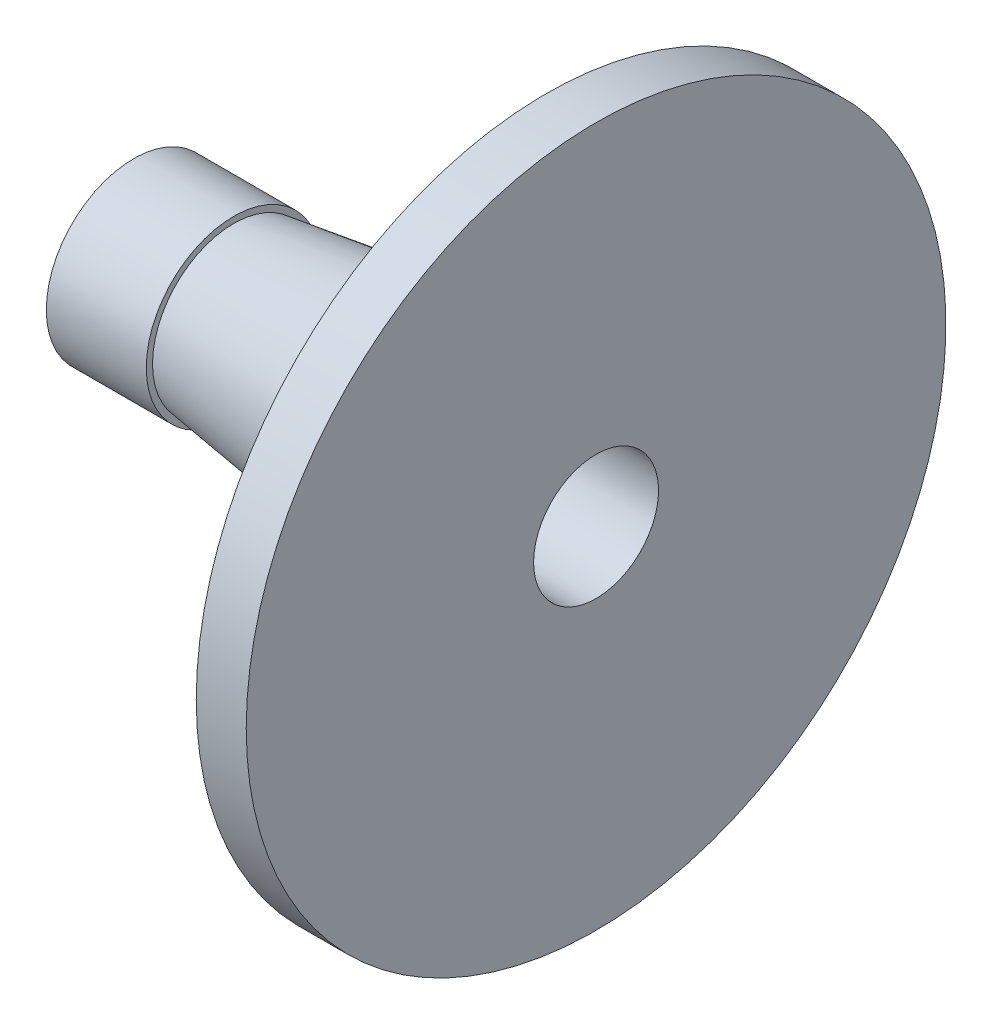
ISO-10303-21;
HEADER;
FILE_DESCRIPTION(('STEP AP214'),'2;1');
FILE_NAME('part.step','',(''),(''),'','','');
FILE_SCHEMA(('AUTOMOTIVE_DESIGN { 1 0 10303 214 1 1 1 1 }'));
ENDSEC;
DATA;
#1=APPLICATION_CONTEXT('core data for automotive mechanical design processes');
#2=APPLICATION_PROTOCOL_DEFINITION('international standard','automotive_design',2000,#1);
#3=PRODUCT_CONTEXT('',#1,'mechanical');
#4=PRODUCT('Part','Part','',(#3));
#5=PRODUCT_RELATED_PRODUCT_CATEGORY('part','',(#4));
#6=PRODUCT_DEFINITION_FORMATION('','',#4);
#7=PRODUCT_DEFINITION_CONTEXT('part definition',#1,'design');
#8=PRODUCT_DEFINITION('design','',#6,#7);
#9=PRODUCT_DEFINITION_SHAPE('','',#8);
#10=(LENGTH_UNIT() NAMED_UNIT(*) SI_UNIT(.MILLI.,.METRE.));
#11=(NAMED_UNIT(*) PLANE_ANGLE_UNIT() SI_UNIT($,.RADIAN.));
#12=(NAMED_UNIT(*) SI_UNIT($,.STERADIAN.) SOLID_ANGLE_UNIT());
#13=UNCERTAINTY_MEASURE_WITH_UNIT(LENGTH_MEASURE(1.E-05),#10,'distance_accuracy_value','');
#14=(GEOMETRIC_REPRESENTATION_CONTEXT(3) GLOBAL_UNCERTAINTY_ASSIGNED_CONTEXT((#13)) GLOBAL_UNIT_ASSIGNED_CONTEXT((#10,
#11,#12)) REPRESENTATION_CONTEXT('',''));
#15=CARTESIAN_POINT('',(0.,0.,0.));
#16=DIRECTION('',(0.,0.,1.));
#17=DIRECTION('',(1.,0.,0.));
#18=AXIS2_PLACEMENT_3D('',#15,#16,#17);
#19=CARTESIAN_POINT('',(0.,0.,0.));
#20=DIRECTION('',(-1.,0.,0.));
#21=DIRECTION('',(0.,0.,1.));
#22=AXIS2_PLACEMENT_3D('',#19,#20,#21);
#23=CYLINDRICAL_SURFACE('',#22,140.);
#24=CARTESIAN_POINT('',(165.,0.,0.));
#25=DIRECTION('',(-1.,0.,0.));
#26=DIRECTION('',(0.,0.,1.));
#27=AXIS2_PLACEMENT_3D('',#24,#25,#26);
#28=CIRCLE('',#27,140.);
#29=CARTESIAN_POINT('',(165.,0.,140.));
#30=VERTEX_POINT('',#29);
#31=EDGE_CURVE('E10',#30,#30,#28,.T.);
#32=ORIENTED_EDGE('',*,*,#31,.F.);
#33=EDGE_LOOP('',(#32));
#34=FACE_BOUND('',#33,.T.);
#35=CARTESIAN_POINT('',(185.,0.,0.));
#36=DIRECTION('',(-1.,0.,0.));
#37=DIRECTION('',(0.,0.,1.));
#38=AXIS2_PLACEMENT_3D('',#35,#36,#37);
#39=CIRCLE('',#38,140.);
#40=CARTESIAN_POINT('',(185.,0.,140.));
#41=VERTEX_POINT('',#40);
#42=EDGE_CURVE('E63',#41,#41,#39,.T.);
#43=ORIENTED_EDGE('',*,*,#42,.T.);
#44=EDGE_LOOP('',(#43));
#45=FACE_BOUND('',#44,.T.);
#46=ADVANCED_FACE('F35',(#34,#45),#23,.T.);
#47=CARTESIAN_POINT('',(165.,140.,0.));
#48=DIRECTION('',(1.,0.,0.));
#49=DIRECTION('',(0.,0.,-1.));
#50=AXIS2_PLACEMENT_3D('',#47,#48,#49);
#51=PLANE('',#50);
#52=CARTESIAN_POINT('',(165.,0.,0.));
#53=DIRECTION('',(-1.,0.,0.));
#54=DIRECTION('',(0.,0.,1.));
#55=AXIS2_PLACEMENT_3D('',#52,#53,#54);
#56=CIRCLE('',#55,50.);
#57=CARTESIAN_POINT('',(165.,0.,50.));
#58=VERTEX_POINT('',#57);
#59=EDGE_CURVE('E41',#58,#58,#56,.T.);
#60=ORIENTED_EDGE('',*,*,#59,.F.);
#61=EDGE_LOOP('',(#60));
#62=FACE_BOUND('',#61,.T.);
#63=ORIENTED_EDGE('',*,*,#31,.T.);
#64=EDGE_LOOP('',(#63));
#65=FACE_BOUND('',#64,.T.);
#66=ADVANCED_FACE('F100',(#62,#65),#51,.F.);
#67=CARTESIAN_POINT('',(165.,0.,0.));
#68=DIRECTION('',(1.,0.,0.));
#69=DIRECTION('',(0.,0.,-1.));
#70=AXIS2_PLACEMENT_3D('',#67,#68,#69);
#71=CONICAL_SURFACE('',#70,50.,0.139095941482071);
#72=CARTESIAN_POINT('',(40.,0.,0.));
#73=DIRECTION('',(-1.,0.,0.));
#74=DIRECTION('',(0.,0.,1.));
#75=AXIS2_PLACEMENT_3D('',#72,#73,#74);
#76=CIRCLE('',#75,32.5);
#77=CARTESIAN_POINT('',(40.,0.,32.5));
#78=VERTEX_POINT('',#77);
#79=EDGE_CURVE('E45',#78,#78,#76,.T.);
#80=ORIENTED_EDGE('',*,*,#79,.F.);
#81=EDGE_LOOP('',(#80));
#82=FACE_BOUND('',#81,.T.);
#83=ORIENTED_EDGE('',*,*,#59,.T.);
#84=EDGE_LOOP('',(#83));
#85=FACE_BOUND('',#84,.T.);
#86=ADVANCED_FACE('F95',(#82,#85),#71,.T.);
#87=CARTESIAN_POINT('',(40.,32.5,0.));
#88=DIRECTION('',(-1.,0.,0.));
#89=DIRECTION('',(0.,0.,1.));
#90=AXIS2_PLACEMENT_3D('',#87,#88,#89);
#91=PLANE('',#90);
#92=CARTESIAN_POINT('',(40.,0.,0.));
#93=DIRECTION('',(-1.,0.,0.));
#94=DIRECTION('',(0.,0.,1.));
#95=AXIS2_PLACEMENT_3D('',#92,#93,#94);
#96=CIRCLE('',#95,35.);
#97=CARTESIAN_POINT('',(40.,0.,35.));
#98=VERTEX_POINT('',#97);
#99=EDGE_CURVE('E49',#98,#98,#96,.T.);
#100=ORIENTED_EDGE('',*,*,#99,.F.);
#101=EDGE_LOOP('',(#100));
#102=FACE_BOUND('',#101,.T.);
#103=ORIENTED_EDGE('',*,*,#79,.T.);
#104=EDGE_LOOP('',(#103));
#105=FACE_BOUND('',#104,.T.);
#106=ADVANCED_FACE('F89',(#102,#105),#91,.F.);
#107=CARTESIAN_POINT('',(0.,0.,0.));
#108=DIRECTION('',(-1.,0.,0.));
#109=DIRECTION('',(0.,0.,1.));
#110=AXIS2_PLACEMENT_3D('',#107,#108,#109);
#111=CYLINDRICAL_SURFACE('',#110,35.);
#112=CARTESIAN_POINT('',(0.,0.,0.));
#113=DIRECTION('',(-1.,0.,0.));
#114=DIRECTION('',(0.,0.,1.));
#115=AXIS2_PLACEMENT_3D('',#112,#113,#114);
#116=CIRCLE('',#115,35.);
#117=CARTESIAN_POINT('',(0.,0.,35.));
#118=VERTEX_POINT('',#117);
#119=EDGE_CURVE('E54',#118,#118,#116,.T.);
#120=ORIENTED_EDGE('',*,*,#119,.F.);
#121=EDGE_LOOP('',(#120));
#122=FACE_BOUND('',#121,.T.);
#123=ORIENTED_EDGE('',*,*,#99,.T.);
#124=EDGE_LOOP('',(#123));
#125=FACE_BOUND('',#124,.T.);
#126=ADVANCED_FACE('F83',(#122,#125),#111,.T.);
#127=CARTESIAN_POINT('',(0.,35.,0.));
#128=DIRECTION('',(1.,0.,0.));
#129=DIRECTION('',(0.,0.,-1.));
#130=AXIS2_PLACEMENT_3D('',#127,#128,#129);
#131=PLANE('',#130);
#132=CARTESIAN_POINT('',(0.,0.,0.));
#133=DIRECTION('',(-1.,0.,0.));
#134=DIRECTION('',(0.,0.,1.));
#135=AXIS2_PLACEMENT_3D('',#132,#133,#134);
#136=CIRCLE('',#135,25.);
#137=CARTESIAN_POINT('',(0.,0.,25.));
#138=VERTEX_POINT('',#137);
#139=EDGE_CURVE('E57',#138,#138,#136,.T.);
#140=ORIENTED_EDGE('',*,*,#139,.F.);
#141=EDGE_LOOP('',(#140));
#142=FACE_BOUND('',#141,.T.);
#143=ORIENTED_EDGE('',*,*,#119,.T.);
#144=EDGE_LOOP('',(#143));
#145=FACE_BOUND('',#144,.T.);
#146=ADVANCED_FACE('F77',(#142,#145),#131,.F.);
#147=CARTESIAN_POINT('',(0.,0.,0.));
#148=DIRECTION('',(-1.,0.,0.));
#149=DIRECTION('',(0.,0.,1.));
#150=AXIS2_PLACEMENT_3D('',#147,#148,#149);
#151=CYLINDRICAL_SURFACE('',#150,25.);
#152=CARTESIAN_POINT('',(185.,0.,0.));
#153=DIRECTION('',(-1.,0.,0.));
#154=DIRECTION('',(0.,0.,1.));
#155=AXIS2_PLACEMENT_3D('',#152,#153,#154);
#156=CIRCLE('',#155,25.);
#157=CARTESIAN_POINT('',(185.,0.,25.));
#158=VERTEX_POINT('',#157);
#159=EDGE_CURVE('E60',#158,#158,#156,.T.);
#160=ORIENTED_EDGE('',*,*,#159,.F.);
#161=EDGE_LOOP('',(#160));
#162=FACE_BOUND('',#161,.T.);
#163=ORIENTED_EDGE('',*,*,#139,.T.);
#164=EDGE_LOOP('',(#163));
#165=FACE_BOUND('',#164,.T.);
#166=ADVANCED_FACE('F71',(#162,#165),#151,.F.);
#167=CARTESIAN_POINT('',(185.,25.,0.));
#168=DIRECTION('',(-1.,0.,0.));
#169=DIRECTION('',(0.,0.,1.));
#170=AXIS2_PLACEMENT_3D('',#167,#168,#169);
#171=PLANE('',#170);
#172=ORIENTED_EDGE('',*,*,#42,.F.);
#173=EDGE_LOOP('',(#172));
#174=FACE_BOUND('',#173,.T.);
#175=ORIENTED_EDGE('',*,*,#159,.T.);
#176=EDGE_LOOP('',(#175));
#177=FACE_BOUND('',#176,.T.);
#178=ADVANCED_FACE('F68',(#174,#177),#171,.F.);
#179=CLOSED_SHELL('',(#46,#66,#86,#106,#126,#146,#166,#178));
#180=MANIFOLD_SOLID_BREP('B2',#179);
#181=ADVANCED_BREP_SHAPE_REPRESENTATION('',(#18,#180),#14);
#182=SHAPE_DEFINITION_REPRESENTATION(#9,#181);
ENDSEC;
END-ISO-10303-21;
